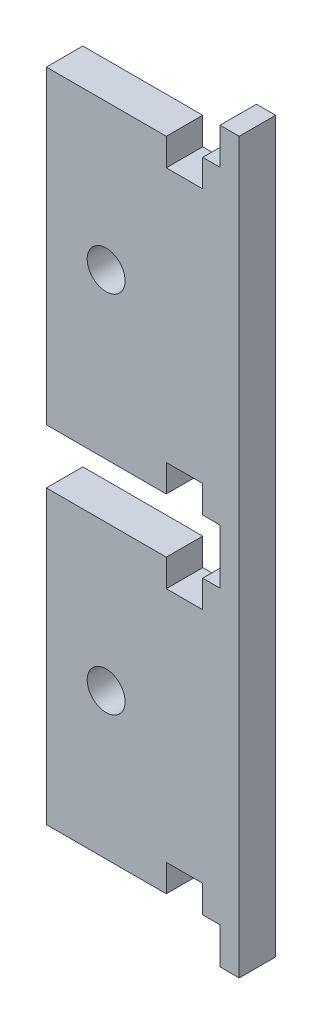
ISO-10303-21;
HEADER;
FILE_DESCRIPTION(('STEP AP214'),'2;1');
FILE_NAME('part.step','',(''),(''),'','','');
FILE_SCHEMA(('AUTOMOTIVE_DESIGN { 1 0 10303 214 1 1 1 1 }'));
ENDSEC;
DATA;
#1=APPLICATION_CONTEXT('core data for automotive mechanical design processes');
#2=APPLICATION_PROTOCOL_DEFINITION('international standard','automotive_design',2000,#1);
#3=PRODUCT_CONTEXT('',#1,'mechanical');
#4=PRODUCT('Part','Part','',(#3));
#5=PRODUCT_RELATED_PRODUCT_CATEGORY('part','',(#4));
#6=PRODUCT_DEFINITION_FORMATION('','',#4);
#7=PRODUCT_DEFINITION_CONTEXT('part definition',#1,'design');
#8=PRODUCT_DEFINITION('design','',#6,#7);
#9=PRODUCT_DEFINITION_SHAPE('','',#8);
#10=(LENGTH_UNIT() NAMED_UNIT(*) SI_UNIT(.MILLI.,.METRE.));
#11=(NAMED_UNIT(*) PLANE_ANGLE_UNIT() SI_UNIT($,.RADIAN.));
#12=(NAMED_UNIT(*) SI_UNIT($,.STERADIAN.) SOLID_ANGLE_UNIT());
#13=UNCERTAINTY_MEASURE_WITH_UNIT(LENGTH_MEASURE(1.E-05),#10,'distance_accuracy_value','');
#14=(GEOMETRIC_REPRESENTATION_CONTEXT(3) GLOBAL_UNCERTAINTY_ASSIGNED_CONTEXT((#13)) GLOBAL_UNIT_ASSIGNED_CONTEXT((#10,
#11,#12)) REPRESENTATION_CONTEXT('',''));
#15=CARTESIAN_POINT('',(0.,0.,0.));
#16=DIRECTION('',(0.,0.,1.));
#17=DIRECTION('',(1.,0.,0.));
#18=AXIS2_PLACEMENT_3D('',#15,#16,#17);
#19=CARTESIAN_POINT('',(0.,6.34999999999999,0.));
#20=DIRECTION('',(0.,1.,0.));
#21=DIRECTION('',(-1.,0.,0.));
#22=AXIS2_PLACEMENT_3D('',#19,#20,#21);
#23=PLANE('',#22);
#24=DIRECTION('',(-1.,0.,0.));
#25=VECTOR('',#24,1.);
#26=CARTESIAN_POINT('',(0.,6.34999999999999,6.35));
#27=LINE('',#26,#25);
#28=CARTESIAN_POINT('',(37.3062500000001,6.34999999999999,6.35));
#29=VERTEX_POINT('',#28);
#30=CARTESIAN_POINT('',(34.29,6.34999999999997,6.35));
#31=VERTEX_POINT('',#30);
#32=EDGE_CURVE('E304',#29,#31,#27,.T.);
#33=ORIENTED_EDGE('',*,*,#32,.T.);
#34=DIRECTION('',(0.,0.,1.));
#35=VECTOR('',#34,1.);
#36=CARTESIAN_POINT('',(34.29,6.34999999999997,0.));
#37=LINE('',#36,#35);
#38=CARTESIAN_POINT('',(34.29,6.34999999999997,0.));
#39=VERTEX_POINT('',#38);
#40=EDGE_CURVE('E382',#39,#31,#37,.T.);
#41=ORIENTED_EDGE('',*,*,#40,.F.);
#42=DIRECTION('',(-1.,0.,0.));
#43=VECTOR('',#42,1.);
#44=CARTESIAN_POINT('',(0.,6.34999999999999,0.));
#45=LINE('',#44,#43);
#46=CARTESIAN_POINT('',(37.3062500000001,6.34999999999999,0.));
#47=VERTEX_POINT('',#46);
#48=EDGE_CURVE('E305',#47,#39,#45,.T.);
#49=ORIENTED_EDGE('',*,*,#48,.F.);
#50=DIRECTION('',(0.,0.,1.));
#51=VECTOR('',#50,1.);
#52=CARTESIAN_POINT('',(37.3062500000001,6.34999999999999,0.));
#53=LINE('',#52,#51);
#54=EDGE_CURVE('E319',#47,#29,#53,.T.);
#55=ORIENTED_EDGE('',*,*,#54,.T.);
#56=EDGE_LOOP('',(#33,#41,#49,#55));
#57=FACE_BOUND('',#56,.T.);
#58=ADVANCED_FACE('F33',(#57),#23,.F.);
#59=CARTESIAN_POINT('',(0.,66.6750000000059,0.));
#60=DIRECTION('',(0.,1.,0.));
#61=DIRECTION('',(-1.,0.,0.));
#62=AXIS2_PLACEMENT_3D('',#59,#60,#61);
#63=PLANE('',#62);
#64=DIRECTION('',(-1.,0.,0.));
#65=VECTOR('',#64,1.);
#66=CARTESIAN_POINT('',(0.,66.6750000000059,6.35));
#67=LINE('',#66,#65);
#68=CARTESIAN_POINT('',(37.3062500000001,66.6750000000059,6.35));
#69=VERTEX_POINT('',#68);
#70=CARTESIAN_POINT('',(34.2899999999998,66.6750000000033,6.35));
#71=VERTEX_POINT('',#70);
#72=EDGE_CURVE('E289',#69,#71,#67,.T.);
#73=ORIENTED_EDGE('',*,*,#72,.T.);
#74=DIRECTION('',(0.,0.,1.));
#75=VECTOR('',#74,1.);
#76=CARTESIAN_POINT('',(34.2899999999998,66.6750000000033,0.));
#77=LINE('',#76,#75);
#78=CARTESIAN_POINT('',(34.2899999999998,66.6750000000033,0.));
#79=VERTEX_POINT('',#78);
#80=EDGE_CURVE('E444',#79,#71,#77,.T.);
#81=ORIENTED_EDGE('',*,*,#80,.F.);
#82=DIRECTION('',(-1.,0.,0.));
#83=VECTOR('',#82,1.);
#84=CARTESIAN_POINT('',(0.,66.6750000000059,0.));
#85=LINE('',#84,#83);
#86=CARTESIAN_POINT('',(37.3062500000001,66.6750000000059,0.));
#87=VERTEX_POINT('',#86);
#88=EDGE_CURVE('E277',#87,#79,#85,.T.);
#89=ORIENTED_EDGE('',*,*,#88,.F.);
#90=DIRECTION('',(0.,0.,1.));
#91=VECTOR('',#90,1.);
#92=CARTESIAN_POINT('',(37.3062500000001,66.6750000000059,0.));
#93=LINE('',#92,#91);
#94=EDGE_CURVE('E295',#87,#69,#93,.T.);
#95=ORIENTED_EDGE('',*,*,#94,.T.);
#96=EDGE_LOOP('',(#73,#81,#89,#95));
#97=FACE_BOUND('',#96,.T.);
#98=ADVANCED_FACE('F502',(#97),#63,.F.);
#99=CARTESIAN_POINT('',(0.,57.1500000000057,0.));
#100=DIRECTION('',(0.,-1.,0.));
#101=DIRECTION('',(0.,0.,-1.));
#102=AXIS2_PLACEMENT_3D('',#99,#100,#101);
#103=PLANE('',#102);
#104=DIRECTION('',(1.,0.,0.));
#105=VECTOR('',#104,1.);
#106=CARTESIAN_POINT('',(0.,57.1500000000057,0.));
#107=LINE('',#106,#105);
#108=CARTESIAN_POINT('',(34.2899999999997,57.1500000000031,0.));
#109=VERTEX_POINT('',#108);
#110=CARTESIAN_POINT('',(37.3062500000001,57.1500000000057,0.));
#111=VERTEX_POINT('',#110);
#112=EDGE_CURVE('E273',#109,#111,#107,.T.);
#113=ORIENTED_EDGE('',*,*,#112,.F.);
#114=DIRECTION('',(0.,0.,1.));
#115=VECTOR('',#114,1.);
#116=CARTESIAN_POINT('',(34.2899999999997,57.1500000000031,0.));
#117=LINE('',#116,#115);
#118=CARTESIAN_POINT('',(34.2899999999997,57.1500000000031,6.35));
#119=VERTEX_POINT('',#118);
#120=EDGE_CURVE('E413',#109,#119,#117,.T.);
#121=ORIENTED_EDGE('',*,*,#120,.T.);
#122=DIRECTION('',(1.,0.,0.));
#123=VECTOR('',#122,1.);
#124=CARTESIAN_POINT('',(0.,57.1500000000057,6.35));
#125=LINE('',#124,#123);
#126=CARTESIAN_POINT('',(37.3062500000001,57.1500000000057,6.35));
#127=VERTEX_POINT('',#126);
#128=EDGE_CURVE('E285',#119,#127,#125,.T.);
#129=ORIENTED_EDGE('',*,*,#128,.T.);
#130=DIRECTION('',(0.,0.,1.));
#131=VECTOR('',#130,1.);
#132=CARTESIAN_POINT('',(37.3062500000001,57.1500000000057,0.));
#133=LINE('',#132,#131);
#134=EDGE_CURVE('E297',#111,#127,#133,.T.);
#135=ORIENTED_EDGE('',*,*,#134,.F.);
#136=EDGE_LOOP('',(#113,#121,#129,#135));
#137=FACE_BOUND('',#136,.T.);
#138=ADVANCED_FACE('F510',(#137),#103,.F.);
#139=CARTESIAN_POINT('',(0.,120.650000000002,0.));
#140=DIRECTION('',(0.,-1.,0.));
#141=DIRECTION('',(0.,0.,-1.));
#142=AXIS2_PLACEMENT_3D('',#139,#140,#141);
#143=PLANE('',#142);
#144=DIRECTION('',(1.,0.,0.));
#145=VECTOR('',#144,1.);
#146=CARTESIAN_POINT('',(0.,120.650000000002,0.));
#147=LINE('',#146,#145);
#148=CARTESIAN_POINT('',(34.2899999999998,120.65,0.));
#149=VERTEX_POINT('',#148);
#150=CARTESIAN_POINT('',(37.3062500000001,120.650000000002,0.));
#151=VERTEX_POINT('',#150);
#152=EDGE_CURVE('E235',#149,#151,#147,.T.);
#153=ORIENTED_EDGE('',*,*,#152,.F.);
#154=DIRECTION('',(0.,0.,1.));
#155=VECTOR('',#154,1.);
#156=CARTESIAN_POINT('',(34.2899999999998,120.65,0.));
#157=LINE('',#156,#155);
#158=CARTESIAN_POINT('',(34.2899999999998,120.65,6.35));
#159=VERTEX_POINT('',#158);
#160=EDGE_CURVE('E218',#149,#159,#157,.T.);
#161=ORIENTED_EDGE('',*,*,#160,.T.);
#162=DIRECTION('',(1.,0.,0.));
#163=VECTOR('',#162,1.);
#164=CARTESIAN_POINT('',(0.,120.650000000002,6.35));
#165=LINE('',#164,#163);
#166=CARTESIAN_POINT('',(37.3062500000001,120.650000000002,6.35));
#167=VERTEX_POINT('',#166);
#168=EDGE_CURVE('E261',#159,#167,#165,.T.);
#169=ORIENTED_EDGE('',*,*,#168,.T.);
#170=DIRECTION('',(0.,0.,1.));
#171=VECTOR('',#170,1.);
#172=CARTESIAN_POINT('',(37.3062500000001,120.650000000002,0.));
#173=LINE('',#172,#171);
#174=EDGE_CURVE('E245',#151,#167,#173,.T.);
#175=ORIENTED_EDGE('',*,*,#174,.F.);
#176=EDGE_LOOP('',(#153,#161,#169,#175));
#177=FACE_BOUND('',#176,.T.);
#178=ADVANCED_FACE('F243',(#177),#143,.F.);
#179=CARTESIAN_POINT('',(0.,0.,0.));
#180=DIRECTION('',(0.,0.,-1.));
#181=DIRECTION('',(-1.,0.,0.));
#182=AXIS2_PLACEMENT_3D('',#179,#180,#181);
#183=PLANE('',#182);
#184=DIRECTION('',(0.,1.,0.));
#185=VECTOR('',#184,1.);
#186=CARTESIAN_POINT('',(34.2899999999998,120.65,0.));
#187=LINE('',#186,#185);
#188=CARTESIAN_POINT('',(34.2899999999998,115.8875,0.));
#189=VERTEX_POINT('',#188);
#190=EDGE_CURVE('E221',#189,#149,#187,.T.);
#191=ORIENTED_EDGE('',*,*,#190,.T.);
#192=ORIENTED_EDGE('',*,*,#152,.T.);
#193=DIRECTION('',(0.,-1.,0.));
#194=VECTOR('',#193,1.);
#195=CARTESIAN_POINT('',(37.3062500000001,0.,0.));
#196=LINE('',#195,#194);
#197=CARTESIAN_POINT('',(37.30625,127.,0.));
#198=VERTEX_POINT('',#197);
#199=EDGE_CURVE('E250',#198,#151,#196,.T.);
#200=ORIENTED_EDGE('',*,*,#199,.F.);
#201=DIRECTION('',(-1.,0.,0.));
#202=VECTOR('',#201,1.);
#203=CARTESIAN_POINT('',(0.,127.,0.));
#204=LINE('',#203,#202);
#205=CARTESIAN_POINT('',(40.64,127.,0.));
#206=VERTEX_POINT('',#205);
#207=EDGE_CURVE('E345',#206,#198,#204,.T.);
#208=ORIENTED_EDGE('',*,*,#207,.F.);
#209=DIRECTION('',(0.,1.,0.));
#210=VECTOR('',#209,1.);
#211=CARTESIAN_POINT('',(40.64,0.,0.));
#212=LINE('',#211,#210);
#213=CARTESIAN_POINT('',(40.64,0.,0.));
#214=VERTEX_POINT('',#213);
#215=EDGE_CURVE('E351',#214,#206,#212,.T.);
#216=ORIENTED_EDGE('',*,*,#215,.F.);
#217=DIRECTION('',(1.,0.,0.));
#218=VECTOR('',#217,1.);
#219=CARTESIAN_POINT('',(0.,0.,0.));
#220=LINE('',#219,#218);
#221=CARTESIAN_POINT('',(37.3062500000001,0.,0.));
#222=VERTEX_POINT('',#221);
#223=EDGE_CURVE('E341',#222,#214,#220,.T.);
#224=ORIENTED_EDGE('',*,*,#223,.F.);
#225=DIRECTION('',(0.,-1.,0.));
#226=VECTOR('',#225,1.);
#227=CARTESIAN_POINT('',(37.3062500000001,0.,0.));
#228=LINE('',#227,#226);
#229=EDGE_CURVE('E301',#47,#222,#228,.T.);
#230=ORIENTED_EDGE('',*,*,#229,.F.);
#231=ORIENTED_EDGE('',*,*,#48,.T.);
#232=DIRECTION('',(0.,1.,0.));
#233=VECTOR('',#232,1.);
#234=CARTESIAN_POINT('',(34.29,11.1125,0.));
#235=LINE('',#234,#233);
#236=CARTESIAN_POINT('',(34.29,11.1125,0.));
#237=VERTEX_POINT('',#236);
#238=EDGE_CURVE('E405',#39,#237,#235,.T.);
#239=ORIENTED_EDGE('',*,*,#238,.T.);
#240=DIRECTION('',(-1.,0.,0.));
#241=VECTOR('',#240,1.);
#242=CARTESIAN_POINT('',(34.29,11.1125,0.));
#243=LINE('',#242,#241);
#244=CARTESIAN_POINT('',(27.94,11.1125,0.));
#245=VERTEX_POINT('',#244);
#246=EDGE_CURVE('E401',#237,#245,#243,.T.);
#247=ORIENTED_EDGE('',*,*,#246,.T.);
#248=DIRECTION('',(0.,-1.,0.));
#249=VECTOR('',#248,1.);
#250=CARTESIAN_POINT('',(27.94,11.1125,0.));
#251=LINE('',#250,#249);
#252=CARTESIAN_POINT('',(27.94,6.34999999999997,0.));
#253=VERTEX_POINT('',#252);
#254=EDGE_CURVE('E397',#245,#253,#251,.T.);
#255=ORIENTED_EDGE('',*,*,#254,.T.);
#256=CARTESIAN_POINT('',(7.05049999999835,6.34999999999999,0.));
#257=VERTEX_POINT('',#256);
#258=EDGE_CURVE('E303',#253,#257,#45,.T.);
#259=ORIENTED_EDGE('',*,*,#258,.T.);
#260=DIRECTION('',(0.,-1.,0.));
#261=VECTOR('',#260,1.);
#262=CARTESIAN_POINT('',(7.05049999999835,0.,0.));
#263=LINE('',#262,#261);
#264=CARTESIAN_POINT('',(7.05049999999834,57.1500000000057,0.));
#265=VERTEX_POINT('',#264);
#266=EDGE_CURVE('E266',#265,#257,#263,.T.);
#267=ORIENTED_EDGE('',*,*,#266,.F.);
#268=CARTESIAN_POINT('',(27.9399999999997,57.1500000000057,0.));
#269=VERTEX_POINT('',#268);
#270=EDGE_CURVE('E269',#265,#269,#107,.T.);
#271=ORIENTED_EDGE('',*,*,#270,.T.);
#272=DIRECTION('',(0.,-1.,0.));
#273=VECTOR('',#272,1.);
#274=CARTESIAN_POINT('',(27.9399999999997,57.1500000000031,0.));
#275=LINE('',#274,#273);
#276=CARTESIAN_POINT('',(27.9399999999997,52.3875000000031,0.));
#277=VERTEX_POINT('',#276);
#278=EDGE_CURVE('E432',#269,#277,#275,.T.);
#279=ORIENTED_EDGE('',*,*,#278,.T.);
#280=DIRECTION('',(1.,0.,0.));
#281=VECTOR('',#280,1.);
#282=CARTESIAN_POINT('',(34.2899999999997,52.3875000000031,0.));
#283=LINE('',#282,#281);
#284=CARTESIAN_POINT('',(34.2899999999997,52.3875000000031,0.));
#285=VERTEX_POINT('',#284);
#286=EDGE_CURVE('E417',#277,#285,#283,.T.);
#287=ORIENTED_EDGE('',*,*,#286,.T.);
#288=DIRECTION('',(0.,1.,0.));
#289=VECTOR('',#288,1.);
#290=CARTESIAN_POINT('',(34.2899999999997,57.1500000000031,0.));
#291=LINE('',#290,#289);
#292=EDGE_CURVE('E427',#285,#109,#291,.T.);
#293=ORIENTED_EDGE('',*,*,#292,.T.);
#294=ORIENTED_EDGE('',*,*,#112,.T.);
#295=DIRECTION('',(0.,-1.,0.));
#296=VECTOR('',#295,1.);
#297=CARTESIAN_POINT('',(37.3062500000001,0.,0.));
#298=LINE('',#297,#296);
#299=EDGE_CURVE('E272',#87,#111,#298,.T.);
#300=ORIENTED_EDGE('',*,*,#299,.F.);
#301=ORIENTED_EDGE('',*,*,#88,.T.);
#302=DIRECTION('',(0.,1.,0.));
#303=VECTOR('',#302,1.);
#304=CARTESIAN_POINT('',(34.2899999999998,71.4375000000033,0.));
#305=LINE('',#304,#303);
#306=CARTESIAN_POINT('',(34.2899999999998,71.4375000000033,0.));
#307=VERTEX_POINT('',#306);
#308=EDGE_CURVE('E447',#79,#307,#305,.T.);
#309=ORIENTED_EDGE('',*,*,#308,.T.);
#310=DIRECTION('',(-1.,0.,0.));
#311=VECTOR('',#310,1.);
#312=CARTESIAN_POINT('',(34.2899999999998,71.4375000000033,0.));
#313=LINE('',#312,#311);
#314=CARTESIAN_POINT('',(27.9399999999998,71.4375000000033,0.));
#315=VERTEX_POINT('',#314);
#316=EDGE_CURVE('E455',#307,#315,#313,.T.);
#317=ORIENTED_EDGE('',*,*,#316,.T.);
#318=DIRECTION('',(0.,-1.,0.));
#319=VECTOR('',#318,1.);
#320=CARTESIAN_POINT('',(27.9399999999998,71.4375000000033,0.));
#321=LINE('',#320,#319);
#322=CARTESIAN_POINT('',(27.9399999999998,66.6750000000033,0.));
#323=VERTEX_POINT('',#322);
#324=EDGE_CURVE('E440',#315,#323,#321,.T.);
#325=ORIENTED_EDGE('',*,*,#324,.T.);
#326=CARTESIAN_POINT('',(7.05049999999834,66.6750000000059,0.));
#327=VERTEX_POINT('',#326);
#328=EDGE_CURVE('E276',#323,#327,#85,.T.);
#329=ORIENTED_EDGE('',*,*,#328,.T.);
#330=CARTESIAN_POINT('',(7.05049999999834,120.650000000002,0.));
#331=VERTEX_POINT('',#330);
#332=EDGE_CURVE('E324',#331,#327,#263,.T.);
#333=ORIENTED_EDGE('',*,*,#332,.F.);
#334=CARTESIAN_POINT('',(27.9399999999998,120.650000000002,0.));
#335=VERTEX_POINT('',#334);
#336=EDGE_CURVE('E246',#331,#335,#147,.T.);
#337=ORIENTED_EDGE('',*,*,#336,.T.);
#338=DIRECTION('',(0.,-1.,0.));
#339=VECTOR('',#338,1.);
#340=CARTESIAN_POINT('',(27.9399999999998,120.65,0.));
#341=LINE('',#340,#339);
#342=CARTESIAN_POINT('',(27.9399999999998,115.8875,0.));
#343=VERTEX_POINT('',#342);
#344=EDGE_CURVE('E239',#335,#343,#341,.T.);
#345=ORIENTED_EDGE('',*,*,#344,.T.);
#346=DIRECTION('',(1.,0.,0.));
#347=VECTOR('',#346,1.);
#348=CARTESIAN_POINT('',(34.2899999999998,115.8875,0.));
#349=LINE('',#348,#347);
#350=EDGE_CURVE('E229',#343,#189,#349,.T.);
#351=ORIENTED_EDGE('',*,*,#350,.T.);
#352=EDGE_LOOP('',(#191,#192,#200,#208,#216,#224,#230,#231,#239,#247,#255,#259,#267,#271,#279,
#287,#293,#294,#300,#301,#309,#317,#325,#329,#333,#337,#345,#351));
#353=FACE_BOUND('',#352,.T.);
#354=CARTESIAN_POINT('',(17.4625000000007,31.7500000000036,0.));
#355=DIRECTION('',(0.,0.,1.));
#356=DIRECTION('',(1.,0.,0.));
#357=AXIS2_PLACEMENT_3D('',#354,#355,#356);
#358=CIRCLE('',#357,3.3);
#359=CARTESIAN_POINT('',(20.7625000000007,31.7500000000036,0.));
#360=VERTEX_POINT('',#359);
#361=EDGE_CURVE('E332',#360,#360,#358,.T.);
#362=ORIENTED_EDGE('',*,*,#361,.T.);
#363=EDGE_LOOP('',(#362));
#364=FACE_BOUND('',#363,.T.);
#365=CARTESIAN_POINT('',(17.4624999999983,95.25,0.));
#366=DIRECTION('',(0.,0.,1.));
#367=DIRECTION('',(1.,0.,0.));
#368=AXIS2_PLACEMENT_3D('',#365,#366,#367);
#369=CIRCLE('',#368,3.3);
#370=CARTESIAN_POINT('',(20.7624999999983,95.25,0.));
#371=VERTEX_POINT('',#370);
#372=EDGE_CURVE('E338',#371,#371,#369,.T.);
#373=ORIENTED_EDGE('',*,*,#372,.T.);
#374=EDGE_LOOP('',(#373));
#375=FACE_BOUND('',#374,.T.);
#376=ADVANCED_FACE('F232',(#353,#364,#375),#183,.T.);
#377=CARTESIAN_POINT('',(0.,0.,6.35));
#378=DIRECTION('',(0.,0.,-1.));
#379=DIRECTION('',(-1.,0.,0.));
#380=AXIS2_PLACEMENT_3D('',#377,#378,#379);
#381=PLANE('',#380);
#382=CARTESIAN_POINT('',(17.4625000000007,31.7500000000036,6.35));
#383=DIRECTION('',(0.,0.,1.));
#384=DIRECTION('',(1.,0.,0.));
#385=AXIS2_PLACEMENT_3D('',#382,#383,#384);
#386=CIRCLE('',#385,3.29999999999999);
#387=CARTESIAN_POINT('',(20.7625000000006,31.7500000000036,6.35));
#388=VERTEX_POINT('',#387);
#389=EDGE_CURVE('E329',#388,#388,#386,.T.);
#390=ORIENTED_EDGE('',*,*,#389,.F.);
#391=EDGE_LOOP('',(#390));
#392=FACE_BOUND('',#391,.T.);
#393=CARTESIAN_POINT('',(17.4624999999983,95.25,6.35));
#394=DIRECTION('',(0.,0.,1.));
#395=DIRECTION('',(1.,0.,0.));
#396=AXIS2_PLACEMENT_3D('',#393,#394,#395);
#397=CIRCLE('',#396,3.29999999999999);
#398=CARTESIAN_POINT('',(20.7624999999983,95.25,6.35));
#399=VERTEX_POINT('',#398);
#400=EDGE_CURVE('E335',#399,#399,#397,.T.);
#401=ORIENTED_EDGE('',*,*,#400,.F.);
#402=EDGE_LOOP('',(#401));
#403=FACE_BOUND('',#402,.T.);
#404=ORIENTED_EDGE('',*,*,#168,.F.);
#405=DIRECTION('',(0.,1.,0.));
#406=VECTOR('',#405,1.);
#407=CARTESIAN_POINT('',(34.2899999999998,120.65,6.35));
#408=LINE('',#407,#406);
#409=CARTESIAN_POINT('',(34.2899999999998,115.8875,6.35));
#410=VERTEX_POINT('',#409);
#411=EDGE_CURVE('E224',#410,#159,#408,.T.);
#412=ORIENTED_EDGE('',*,*,#411,.F.);
#413=DIRECTION('',(1.,0.,0.));
#414=VECTOR('',#413,1.);
#415=CARTESIAN_POINT('',(34.2899999999998,115.8875,6.35));
#416=LINE('',#415,#414);
#417=CARTESIAN_POINT('',(27.9399999999998,115.8875,6.35));
#418=VERTEX_POINT('',#417);
#419=EDGE_CURVE('E240',#418,#410,#416,.T.);
#420=ORIENTED_EDGE('',*,*,#419,.F.);
#421=DIRECTION('',(0.,-1.,0.));
#422=VECTOR('',#421,1.);
#423=CARTESIAN_POINT('',(27.9399999999998,120.65,6.35));
#424=LINE('',#423,#422);
#425=CARTESIAN_POINT('',(27.9399999999998,120.65,6.35));
#426=VERTEX_POINT('',#425);
#427=EDGE_CURVE('E466',#426,#418,#424,.T.);
#428=ORIENTED_EDGE('',*,*,#427,.F.);
#429=CARTESIAN_POINT('',(7.05049999999834,120.650000000002,6.35));
#430=VERTEX_POINT('',#429);
#431=EDGE_CURVE('E252',#430,#426,#165,.T.);
#432=ORIENTED_EDGE('',*,*,#431,.F.);
#433=DIRECTION('',(0.,1.,0.));
#434=VECTOR('',#433,1.);
#435=CARTESIAN_POINT('',(7.05049999999835,0.,6.35));
#436=LINE('',#435,#434);
#437=CARTESIAN_POINT('',(7.05049999999834,66.6750000000059,6.35));
#438=VERTEX_POINT('',#437);
#439=EDGE_CURVE('E325',#438,#430,#436,.T.);
#440=ORIENTED_EDGE('',*,*,#439,.F.);
#441=CARTESIAN_POINT('',(27.9399999999998,66.6750000000059,6.35));
#442=VERTEX_POINT('',#441);
#443=EDGE_CURVE('E288',#442,#438,#67,.T.);
#444=ORIENTED_EDGE('',*,*,#443,.F.);
#445=DIRECTION('',(0.,-1.,0.));
#446=VECTOR('',#445,1.);
#447=CARTESIAN_POINT('',(27.9399999999998,71.4375000000033,6.35));
#448=LINE('',#447,#446);
#449=CARTESIAN_POINT('',(27.9399999999998,71.4375000000033,6.35));
#450=VERTEX_POINT('',#449);
#451=EDGE_CURVE('E56',#450,#442,#448,.T.);
#452=ORIENTED_EDGE('',*,*,#451,.F.);
#453=DIRECTION('',(-1.,0.,0.));
#454=VECTOR('',#453,1.);
#455=CARTESIAN_POINT('',(34.2899999999998,71.4375000000033,6.35));
#456=LINE('',#455,#454);
#457=CARTESIAN_POINT('',(34.2899999999998,71.4375000000033,6.35));
#458=VERTEX_POINT('',#457);
#459=EDGE_CURVE('E448',#458,#450,#456,.T.);
#460=ORIENTED_EDGE('',*,*,#459,.F.);
#461=DIRECTION('',(0.,1.,0.));
#462=VECTOR('',#461,1.);
#463=CARTESIAN_POINT('',(34.2899999999998,71.4375000000033,6.35));
#464=LINE('',#463,#462);
#465=EDGE_CURVE('E423',#71,#458,#464,.T.);
#466=ORIENTED_EDGE('',*,*,#465,.F.);
#467=ORIENTED_EDGE('',*,*,#72,.F.);
#468=DIRECTION('',(0.,-1.,0.));
#469=VECTOR('',#468,1.);
#470=CARTESIAN_POINT('',(37.3062500000001,0.,6.35));
#471=LINE('',#470,#469);
#472=EDGE_CURVE('E284',#69,#127,#471,.T.);
#473=ORIENTED_EDGE('',*,*,#472,.T.);
#474=ORIENTED_EDGE('',*,*,#128,.F.);
#475=DIRECTION('',(0.,1.,0.));
#476=VECTOR('',#475,1.);
#477=CARTESIAN_POINT('',(34.2899999999997,57.1500000000031,6.35));
#478=LINE('',#477,#476);
#479=CARTESIAN_POINT('',(34.2899999999997,52.3875000000031,6.35));
#480=VERTEX_POINT('',#479);
#481=EDGE_CURVE('E386',#480,#119,#478,.T.);
#482=ORIENTED_EDGE('',*,*,#481,.F.);
#483=DIRECTION('',(1.,0.,0.));
#484=VECTOR('',#483,1.);
#485=CARTESIAN_POINT('',(34.2899999999997,52.3875000000031,6.35));
#486=LINE('',#485,#484);
#487=CARTESIAN_POINT('',(27.9399999999997,52.3875000000031,6.35));
#488=VERTEX_POINT('',#487);
#489=EDGE_CURVE('E424',#488,#480,#486,.T.);
#490=ORIENTED_EDGE('',*,*,#489,.F.);
#491=DIRECTION('',(0.,-1.,0.));
#492=VECTOR('',#491,1.);
#493=CARTESIAN_POINT('',(27.9399999999997,57.1500000000031,6.35));
#494=LINE('',#493,#492);
#495=CARTESIAN_POINT('',(27.9399999999997,57.1500000000031,6.35));
#496=VERTEX_POINT('',#495);
#497=EDGE_CURVE('E389',#496,#488,#494,.T.);
#498=ORIENTED_EDGE('',*,*,#497,.F.);
#499=CARTESIAN_POINT('',(7.05049999999834,57.1500000000057,6.35));
#500=VERTEX_POINT('',#499);
#501=EDGE_CURVE('E281',#500,#496,#125,.T.);
#502=ORIENTED_EDGE('',*,*,#501,.F.);
#503=CARTESIAN_POINT('',(7.05049999999835,6.34999999999999,6.35));
#504=VERTEX_POINT('',#503);
#505=EDGE_CURVE('E328',#504,#500,#436,.T.);
#506=ORIENTED_EDGE('',*,*,#505,.F.);
#507=CARTESIAN_POINT('',(27.94,6.34999999999999,6.35));
#508=VERTEX_POINT('',#507);
#509=EDGE_CURVE('E312',#508,#504,#27,.T.);
#510=ORIENTED_EDGE('',*,*,#509,.F.);
#511=DIRECTION('',(0.,-1.,0.));
#512=VECTOR('',#511,1.);
#513=CARTESIAN_POINT('',(27.94,11.1125,6.35));
#514=LINE('',#513,#512);
#515=CARTESIAN_POINT('',(27.94,11.1125,6.35));
#516=VERTEX_POINT('',#515);
#517=EDGE_CURVE('E48',#516,#508,#514,.T.);
#518=ORIENTED_EDGE('',*,*,#517,.F.);
#519=DIRECTION('',(-1.,0.,0.));
#520=VECTOR('',#519,1.);
#521=CARTESIAN_POINT('',(34.29,11.1125,6.35));
#522=LINE('',#521,#520);
#523=CARTESIAN_POINT('',(34.29,11.1125,6.35));
#524=VERTEX_POINT('',#523);
#525=EDGE_CURVE('E410',#524,#516,#522,.T.);
#526=ORIENTED_EDGE('',*,*,#525,.F.);
#527=DIRECTION('',(0.,1.,0.));
#528=VECTOR('',#527,1.);
#529=CARTESIAN_POINT('',(34.29,11.1125,6.35));
#530=LINE('',#529,#528);
#531=EDGE_CURVE('E409',#31,#524,#530,.T.);
#532=ORIENTED_EDGE('',*,*,#531,.F.);
#533=ORIENTED_EDGE('',*,*,#32,.F.);
#534=DIRECTION('',(0.,-1.,0.));
#535=VECTOR('',#534,1.);
#536=CARTESIAN_POINT('',(37.3062500000001,0.,6.35));
#537=LINE('',#536,#535);
#538=CARTESIAN_POINT('',(37.3062500000001,0.,6.35));
#539=VERTEX_POINT('',#538);
#540=EDGE_CURVE('E309',#29,#539,#537,.T.);
#541=ORIENTED_EDGE('',*,*,#540,.T.);
#542=DIRECTION('',(1.,0.,0.));
#543=VECTOR('',#542,1.);
#544=CARTESIAN_POINT('',(0.,0.,6.35));
#545=LINE('',#544,#543);
#546=CARTESIAN_POINT('',(40.64,0.,6.35));
#547=VERTEX_POINT('',#546);
#548=EDGE_CURVE('E342',#539,#547,#545,.T.);
#549=ORIENTED_EDGE('',*,*,#548,.T.);
#550=DIRECTION('',(0.,1.,0.));
#551=VECTOR('',#550,1.);
#552=CARTESIAN_POINT('',(40.64,0.,6.35));
#553=LINE('',#552,#551);
#554=CARTESIAN_POINT('',(40.64,127.,6.35));
#555=VERTEX_POINT('',#554);
#556=EDGE_CURVE('E344',#547,#555,#553,.T.);
#557=ORIENTED_EDGE('',*,*,#556,.T.);
#558=DIRECTION('',(-1.,0.,0.));
#559=VECTOR('',#558,1.);
#560=CARTESIAN_POINT('',(0.,127.,6.35));
#561=LINE('',#560,#559);
#562=CARTESIAN_POINT('',(37.30625,127.,6.35));
#563=VERTEX_POINT('',#562);
#564=EDGE_CURVE('E347',#555,#563,#561,.T.);
#565=ORIENTED_EDGE('',*,*,#564,.T.);
#566=DIRECTION('',(0.,-1.,0.));
#567=VECTOR('',#566,1.);
#568=CARTESIAN_POINT('',(37.3062500000001,0.,6.35));
#569=LINE('',#568,#567);
#570=EDGE_CURVE('E247',#563,#167,#569,.T.);
#571=ORIENTED_EDGE('',*,*,#570,.T.);
#572=EDGE_LOOP('',(#404,#412,#420,#428,#432,#440,#444,#452,#460,#466,#467,#473,#474,#482,#490,
#498,#502,#506,#510,#518,#526,#532,#533,#541,#549,#557,#565,#571));
#573=FACE_BOUND('',#572,.T.);
#574=ADVANCED_FACE('F367',(#392,#403,#573),#381,.F.);
#575=CARTESIAN_POINT('',(0.,0.,6.35));
#576=DIRECTION('',(0.,1.,0.));
#577=DIRECTION('',(0.,0.,1.));
#578=AXIS2_PLACEMENT_3D('',#575,#576,#577);
#579=PLANE('',#578);
#580=DIRECTION('',(0.,0.,1.));
#581=VECTOR('',#580,1.);
#582=CARTESIAN_POINT('',(37.3062500000001,0.,0.));
#583=LINE('',#582,#581);
#584=EDGE_CURVE('E308',#222,#539,#583,.T.);
#585=ORIENTED_EDGE('',*,*,#584,.F.);
#586=ORIENTED_EDGE('',*,*,#223,.T.);
#587=DIRECTION('',(0.,0.,-1.));
#588=VECTOR('',#587,1.);
#589=CARTESIAN_POINT('',(40.64,0.,6.35));
#590=LINE('',#589,#588);
#591=EDGE_CURVE('E11',#547,#214,#590,.T.);
#592=ORIENTED_EDGE('',*,*,#591,.F.);
#593=ORIENTED_EDGE('',*,*,#548,.F.);
#594=EDGE_LOOP('',(#585,#586,#592,#593));
#595=FACE_BOUND('',#594,.T.);
#596=ADVANCED_FACE('F35',(#595),#579,.F.);
#597=CARTESIAN_POINT('',(0.,127.,6.35));
#598=DIRECTION('',(0.,-1.,0.));
#599=DIRECTION('',(1.,0.,0.));
#600=AXIS2_PLACEMENT_3D('',#597,#598,#599);
#601=PLANE('',#600);
#602=DIRECTION('',(0.,0.,1.));
#603=VECTOR('',#602,1.);
#604=CARTESIAN_POINT('',(37.30625,127.,0.));
#605=LINE('',#604,#603);
#606=EDGE_CURVE('E263',#198,#563,#605,.T.);
#607=ORIENTED_EDGE('',*,*,#606,.T.);
#608=ORIENTED_EDGE('',*,*,#564,.F.);
#609=DIRECTION('',(0.,0.,-1.));
#610=VECTOR('',#609,1.);
#611=CARTESIAN_POINT('',(40.64,127.,6.35));
#612=LINE('',#611,#610);
#613=EDGE_CURVE('E41',#555,#206,#612,.T.);
#614=ORIENTED_EDGE('',*,*,#613,.T.);
#615=ORIENTED_EDGE('',*,*,#207,.T.);
#616=EDGE_LOOP('',(#607,#608,#614,#615));
#617=FACE_BOUND('',#616,.T.);
#618=ADVANCED_FACE('F359',(#617),#601,.F.);
#619=CARTESIAN_POINT('',(7.05049999999835,0.,0.));
#620=DIRECTION('',(-1.,0.,0.));
#621=DIRECTION('',(0.,-1.,0.));
#622=AXIS2_PLACEMENT_3D('',#619,#620,#621);
#623=PLANE('',#622);
#624=DIRECTION('',(0.,0.,1.));
#625=VECTOR('',#624,1.);
#626=CARTESIAN_POINT('',(7.05049999999834,120.650000000002,0.));
#627=LINE('',#626,#625);
#628=EDGE_CURVE('E259',#331,#430,#627,.T.);
#629=ORIENTED_EDGE('',*,*,#628,.F.);
#630=ORIENTED_EDGE('',*,*,#332,.T.);
#631=DIRECTION('',(0.,0.,1.));
#632=VECTOR('',#631,1.);
#633=CARTESIAN_POINT('',(7.05049999999834,66.6750000000059,0.));
#634=LINE('',#633,#632);
#635=EDGE_CURVE('E292',#327,#438,#634,.T.);
#636=ORIENTED_EDGE('',*,*,#635,.T.);
#637=ORIENTED_EDGE('',*,*,#439,.T.);
#638=EDGE_LOOP('',(#629,#630,#636,#637));
#639=FACE_BOUND('',#638,.T.);
#640=ADVANCED_FACE('F484',(#639),#623,.T.);
#641=CARTESIAN_POINT('',(40.64,0.,6.35));
#642=DIRECTION('',(-1.,0.,0.));
#643=DIRECTION('',(0.,0.,1.));
#644=AXIS2_PLACEMENT_3D('',#641,#642,#643);
#645=PLANE('',#644);
#646=ORIENTED_EDGE('',*,*,#215,.T.);
#647=ORIENTED_EDGE('',*,*,#613,.F.);
#648=ORIENTED_EDGE('',*,*,#556,.F.);
#649=ORIENTED_EDGE('',*,*,#591,.T.);
#650=EDGE_LOOP('',(#646,#647,#648,#649));
#651=FACE_BOUND('',#650,.T.);
#652=ADVANCED_FACE('F370',(#651),#645,.F.);
#653=CARTESIAN_POINT('',(17.4624999999983,95.25,6.35));
#654=DIRECTION('',(0.,0.,1.));
#655=DIRECTION('',(1.,0.,0.));
#656=AXIS2_PLACEMENT_3D('',#653,#654,#655);
#657=CYLINDRICAL_SURFACE('',#656,3.29999999999999);
#658=ORIENTED_EDGE('',*,*,#372,.F.);
#659=EDGE_LOOP('',(#658));
#660=FACE_BOUND('',#659,.T.);
#661=ORIENTED_EDGE('',*,*,#400,.T.);
#662=EDGE_LOOP('',(#661));
#663=FACE_BOUND('',#662,.T.);
#664=ADVANCED_FACE('F567',(#660,#663),#657,.F.);
#665=CARTESIAN_POINT('',(17.4625000000007,31.7500000000036,6.35));
#666=DIRECTION('',(0.,0.,1.));
#667=DIRECTION('',(1.,0.,0.));
#668=AXIS2_PLACEMENT_3D('',#665,#666,#667);
#669=CYLINDRICAL_SURFACE('',#668,3.29999999999999);
#670=ORIENTED_EDGE('',*,*,#361,.F.);
#671=EDGE_LOOP('',(#670));
#672=FACE_BOUND('',#671,.T.);
#673=ORIENTED_EDGE('',*,*,#389,.T.);
#674=EDGE_LOOP('',(#673));
#675=FACE_BOUND('',#674,.T.);
#676=ADVANCED_FACE('F562',(#672,#675),#669,.F.);
#677=DIRECTION('',(0.,0.,1.));
#678=VECTOR('',#677,1.);
#679=CARTESIAN_POINT('',(7.05049999999834,57.1500000000057,0.));
#680=LINE('',#679,#678);
#681=EDGE_CURVE('E280',#265,#500,#680,.T.);
#682=ORIENTED_EDGE('',*,*,#681,.F.);
#683=ORIENTED_EDGE('',*,*,#266,.T.);
#684=DIRECTION('',(0.,0.,1.));
#685=VECTOR('',#684,1.);
#686=CARTESIAN_POINT('',(7.05049999999835,6.34999999999999,0.));
#687=LINE('',#686,#685);
#688=EDGE_CURVE('E316',#257,#504,#687,.T.);
#689=ORIENTED_EDGE('',*,*,#688,.T.);
#690=ORIENTED_EDGE('',*,*,#505,.T.);
#691=EDGE_LOOP('',(#682,#683,#689,#690));
#692=FACE_BOUND('',#691,.T.);
#693=ADVANCED_FACE('F532',(#692),#623,.T.);
#694=ORIENTED_EDGE('',*,*,#258,.F.);
#695=DIRECTION('',(0.,0.,1.));
#696=VECTOR('',#695,1.);
#697=CARTESIAN_POINT('',(27.94,6.34999999999997,0.));
#698=LINE('',#697,#696);
#699=EDGE_CURVE('E387',#253,#508,#698,.T.);
#700=ORIENTED_EDGE('',*,*,#699,.T.);
#701=ORIENTED_EDGE('',*,*,#509,.T.);
#702=ORIENTED_EDGE('',*,*,#688,.F.);
#703=EDGE_LOOP('',(#694,#700,#701,#702));
#704=FACE_BOUND('',#703,.T.);
#705=ADVANCED_FACE('F535',(#704),#23,.F.);
#706=CARTESIAN_POINT('',(37.3062500000001,0.,0.));
#707=DIRECTION('',(-1.,0.,0.));
#708=DIRECTION('',(0.,-1.,0.));
#709=AXIS2_PLACEMENT_3D('',#706,#707,#708);
#710=PLANE('',#709);
#711=ORIENTED_EDGE('',*,*,#540,.F.);
#712=ORIENTED_EDGE('',*,*,#54,.F.);
#713=ORIENTED_EDGE('',*,*,#229,.T.);
#714=ORIENTED_EDGE('',*,*,#584,.T.);
#715=EDGE_LOOP('',(#711,#712,#713,#714));
#716=FACE_BOUND('',#715,.T.);
#717=ADVANCED_FACE('F378',(#716),#710,.T.);
#718=ORIENTED_EDGE('',*,*,#328,.F.);
#719=DIRECTION('',(0.,0.,1.));
#720=VECTOR('',#719,1.);
#721=CARTESIAN_POINT('',(27.9399999999998,66.6750000000033,0.));
#722=LINE('',#721,#720);
#723=EDGE_CURVE('E442',#323,#442,#722,.T.);
#724=ORIENTED_EDGE('',*,*,#723,.T.);
#725=ORIENTED_EDGE('',*,*,#443,.T.);
#726=ORIENTED_EDGE('',*,*,#635,.F.);
#727=EDGE_LOOP('',(#718,#724,#725,#726));
#728=FACE_BOUND('',#727,.T.);
#729=ADVANCED_FACE('F489',(#728),#63,.F.);
#730=CARTESIAN_POINT('',(37.3062500000001,0.,0.));
#731=DIRECTION('',(-1.,0.,0.));
#732=DIRECTION('',(0.,-1.,0.));
#733=AXIS2_PLACEMENT_3D('',#730,#731,#732);
#734=PLANE('',#733);
#735=ORIENTED_EDGE('',*,*,#472,.F.);
#736=ORIENTED_EDGE('',*,*,#94,.F.);
#737=ORIENTED_EDGE('',*,*,#299,.T.);
#738=ORIENTED_EDGE('',*,*,#134,.T.);
#739=EDGE_LOOP('',(#735,#736,#737,#738));
#740=FACE_BOUND('',#739,.T.);
#741=ADVANCED_FACE('F508',(#740),#734,.T.);
#742=ORIENTED_EDGE('',*,*,#501,.T.);
#743=DIRECTION('',(0.,0.,1.));
#744=VECTOR('',#743,1.);
#745=CARTESIAN_POINT('',(27.9399999999997,57.1500000000031,0.));
#746=LINE('',#745,#744);
#747=EDGE_CURVE('E416',#269,#496,#746,.T.);
#748=ORIENTED_EDGE('',*,*,#747,.F.);
#749=ORIENTED_EDGE('',*,*,#270,.F.);
#750=ORIENTED_EDGE('',*,*,#681,.T.);
#751=EDGE_LOOP('',(#742,#748,#749,#750));
#752=FACE_BOUND('',#751,.T.);
#753=ADVANCED_FACE('F528',(#752),#103,.F.);
#754=CARTESIAN_POINT('',(37.3062500000001,0.,0.));
#755=DIRECTION('',(-1.,0.,0.));
#756=DIRECTION('',(0.,-1.,0.));
#757=AXIS2_PLACEMENT_3D('',#754,#755,#756);
#758=PLANE('',#757);
#759=ORIENTED_EDGE('',*,*,#570,.F.);
#760=ORIENTED_EDGE('',*,*,#606,.F.);
#761=ORIENTED_EDGE('',*,*,#199,.T.);
#762=ORIENTED_EDGE('',*,*,#174,.T.);
#763=EDGE_LOOP('',(#759,#760,#761,#762));
#764=FACE_BOUND('',#763,.T.);
#765=ADVANCED_FACE('F365',(#764),#758,.T.);
#766=ORIENTED_EDGE('',*,*,#431,.T.);
#767=DIRECTION('',(0.,0.,1.));
#768=VECTOR('',#767,1.);
#769=CARTESIAN_POINT('',(27.9399999999998,120.65,0.));
#770=LINE('',#769,#768);
#771=EDGE_CURVE('E228',#335,#426,#770,.T.);
#772=ORIENTED_EDGE('',*,*,#771,.F.);
#773=ORIENTED_EDGE('',*,*,#336,.F.);
#774=ORIENTED_EDGE('',*,*,#628,.T.);
#775=EDGE_LOOP('',(#766,#772,#773,#774));
#776=FACE_BOUND('',#775,.T.);
#777=ADVANCED_FACE('F477',(#776),#143,.F.);
#778=CARTESIAN_POINT('',(34.2899999999998,120.65,0.));
#779=DIRECTION('',(1.,0.,0.));
#780=DIRECTION('',(0.,0.,-1.));
#781=AXIS2_PLACEMENT_3D('',#778,#779,#780);
#782=PLANE('',#781);
#783=ORIENTED_EDGE('',*,*,#411,.T.);
#784=ORIENTED_EDGE('',*,*,#160,.F.);
#785=ORIENTED_EDGE('',*,*,#190,.F.);
#786=DIRECTION('',(0.,0.,1.));
#787=VECTOR('',#786,1.);
#788=CARTESIAN_POINT('',(34.2899999999998,115.8875,0.));
#789=LINE('',#788,#787);
#790=EDGE_CURVE('E313',#189,#410,#789,.T.);
#791=ORIENTED_EDGE('',*,*,#790,.T.);
#792=EDGE_LOOP('',(#783,#784,#785,#791));
#793=FACE_BOUND('',#792,.T.);
#794=ADVANCED_FACE('F220',(#793),#782,.F.);
#795=CARTESIAN_POINT('',(34.2899999999998,115.8875,0.));
#796=DIRECTION('',(0.,-1.,0.));
#797=DIRECTION('',(0.,0.,-1.));
#798=AXIS2_PLACEMENT_3D('',#795,#796,#797);
#799=PLANE('',#798);
#800=ORIENTED_EDGE('',*,*,#419,.T.);
#801=ORIENTED_EDGE('',*,*,#790,.F.);
#802=ORIENTED_EDGE('',*,*,#350,.F.);
#803=DIRECTION('',(0.,0.,1.));
#804=VECTOR('',#803,1.);
#805=CARTESIAN_POINT('',(27.9399999999998,115.8875,0.));
#806=LINE('',#805,#804);
#807=EDGE_CURVE('E461',#343,#418,#806,.T.);
#808=ORIENTED_EDGE('',*,*,#807,.T.);
#809=EDGE_LOOP('',(#800,#801,#802,#808));
#810=FACE_BOUND('',#809,.T.);
#811=ADVANCED_FACE('F711',(#810),#799,.F.);
#812=CARTESIAN_POINT('',(27.9399999999998,120.65,0.));
#813=DIRECTION('',(-1.,0.,0.));
#814=DIRECTION('',(0.,0.,1.));
#815=AXIS2_PLACEMENT_3D('',#812,#813,#814);
#816=PLANE('',#815);
#817=ORIENTED_EDGE('',*,*,#427,.T.);
#818=ORIENTED_EDGE('',*,*,#807,.F.);
#819=ORIENTED_EDGE('',*,*,#344,.F.);
#820=ORIENTED_EDGE('',*,*,#771,.T.);
#821=EDGE_LOOP('',(#817,#818,#819,#820));
#822=FACE_BOUND('',#821,.T.);
#823=ADVANCED_FACE('F474',(#822),#816,.F.);
#824=CARTESIAN_POINT('',(34.2899999999997,57.1500000000031,0.));
#825=DIRECTION('',(1.,0.,0.));
#826=DIRECTION('',(0.,0.,-1.));
#827=AXIS2_PLACEMENT_3D('',#824,#825,#826);
#828=PLANE('',#827);
#829=ORIENTED_EDGE('',*,*,#481,.T.);
#830=ORIENTED_EDGE('',*,*,#120,.F.);
#831=ORIENTED_EDGE('',*,*,#292,.F.);
#832=DIRECTION('',(0.,0.,1.));
#833=VECTOR('',#832,1.);
#834=CARTESIAN_POINT('',(34.2899999999997,52.3875000000031,0.));
#835=LINE('',#834,#833);
#836=EDGE_CURVE('E421',#285,#480,#835,.T.);
#837=ORIENTED_EDGE('',*,*,#836,.T.);
#838=EDGE_LOOP('',(#829,#830,#831,#837));
#839=FACE_BOUND('',#838,.T.);
#840=ADVANCED_FACE('F516',(#839),#828,.F.);
#841=CARTESIAN_POINT('',(34.2899999999997,52.3875000000031,0.));
#842=DIRECTION('',(0.,-1.,0.));
#843=DIRECTION('',(1.,0.,0.));
#844=AXIS2_PLACEMENT_3D('',#841,#842,#843);
#845=PLANE('',#844);
#846=ORIENTED_EDGE('',*,*,#489,.T.);
#847=ORIENTED_EDGE('',*,*,#836,.F.);
#848=ORIENTED_EDGE('',*,*,#286,.F.);
#849=DIRECTION('',(0.,0.,1.));
#850=VECTOR('',#849,1.);
#851=CARTESIAN_POINT('',(27.9399999999997,52.3875000000031,0.));
#852=LINE('',#851,#850);
#853=EDGE_CURVE('E419',#277,#488,#852,.T.);
#854=ORIENTED_EDGE('',*,*,#853,.T.);
#855=EDGE_LOOP('',(#846,#847,#848,#854));
#856=FACE_BOUND('',#855,.T.);
#857=ADVANCED_FACE('F520',(#856),#845,.F.);
#858=CARTESIAN_POINT('',(27.9399999999997,57.1500000000031,0.));
#859=DIRECTION('',(-1.,0.,0.));
#860=DIRECTION('',(0.,0.,1.));
#861=AXIS2_PLACEMENT_3D('',#858,#859,#860);
#862=PLANE('',#861);
#863=ORIENTED_EDGE('',*,*,#497,.T.);
#864=ORIENTED_EDGE('',*,*,#853,.F.);
#865=ORIENTED_EDGE('',*,*,#278,.F.);
#866=ORIENTED_EDGE('',*,*,#747,.T.);
#867=EDGE_LOOP('',(#863,#864,#865,#866));
#868=FACE_BOUND('',#867,.T.);
#869=ADVANCED_FACE('F522',(#868),#862,.F.);
#870=CARTESIAN_POINT('',(34.2899999999998,71.4375000000033,0.));
#871=DIRECTION('',(1.,0.,0.));
#872=DIRECTION('',(0.,0.,-1.));
#873=AXIS2_PLACEMENT_3D('',#870,#871,#872);
#874=PLANE('',#873);
#875=ORIENTED_EDGE('',*,*,#465,.T.);
#876=DIRECTION('',(0.,0.,1.));
#877=VECTOR('',#876,1.);
#878=CARTESIAN_POINT('',(34.2899999999998,71.4375000000033,0.));
#879=LINE('',#878,#877);
#880=EDGE_CURVE('E437',#307,#458,#879,.T.);
#881=ORIENTED_EDGE('',*,*,#880,.F.);
#882=ORIENTED_EDGE('',*,*,#308,.F.);
#883=ORIENTED_EDGE('',*,*,#80,.T.);
#884=EDGE_LOOP('',(#875,#881,#882,#883));
#885=FACE_BOUND('',#884,.T.);
#886=ADVANCED_FACE('F498',(#885),#874,.F.);
#887=CARTESIAN_POINT('',(27.9399999999998,71.4375000000033,0.));
#888=DIRECTION('',(-1.,0.,0.));
#889=DIRECTION('',(0.,-1.,0.));
#890=AXIS2_PLACEMENT_3D('',#887,#888,#889);
#891=PLANE('',#890);
#892=ORIENTED_EDGE('',*,*,#451,.T.);
#893=ORIENTED_EDGE('',*,*,#723,.F.);
#894=ORIENTED_EDGE('',*,*,#324,.F.);
#895=DIRECTION('',(0.,0.,1.));
#896=VECTOR('',#895,1.);
#897=CARTESIAN_POINT('',(27.9399999999998,71.4375000000033,0.));
#898=LINE('',#897,#896);
#899=EDGE_CURVE('E439',#315,#450,#898,.T.);
#900=ORIENTED_EDGE('',*,*,#899,.T.);
#901=EDGE_LOOP('',(#892,#893,#894,#900));
#902=FACE_BOUND('',#901,.T.);
#903=ADVANCED_FACE('F760',(#902),#891,.F.);
#904=CARTESIAN_POINT('',(34.2899999999998,71.4375000000033,0.));
#905=DIRECTION('',(0.,1.,0.));
#906=DIRECTION('',(0.,0.,1.));
#907=AXIS2_PLACEMENT_3D('',#904,#905,#906);
#908=PLANE('',#907);
#909=ORIENTED_EDGE('',*,*,#459,.T.);
#910=ORIENTED_EDGE('',*,*,#899,.F.);
#911=ORIENTED_EDGE('',*,*,#316,.F.);
#912=ORIENTED_EDGE('',*,*,#880,.T.);
#913=EDGE_LOOP('',(#909,#910,#911,#912));
#914=FACE_BOUND('',#913,.T.);
#915=ADVANCED_FACE('F494',(#914),#908,.F.);
#916=CARTESIAN_POINT('',(34.29,11.1125,0.));
#917=DIRECTION('',(1.,0.,0.));
#918=DIRECTION('',(0.,0.,-1.));
#919=AXIS2_PLACEMENT_3D('',#916,#917,#918);
#920=PLANE('',#919);
#921=ORIENTED_EDGE('',*,*,#531,.T.);
#922=DIRECTION('',(0.,0.,1.));
#923=VECTOR('',#922,1.);
#924=CARTESIAN_POINT('',(34.29,11.1125,0.));
#925=LINE('',#924,#923);
#926=EDGE_CURVE('E256',#237,#524,#925,.T.);
#927=ORIENTED_EDGE('',*,*,#926,.F.);
#928=ORIENTED_EDGE('',*,*,#238,.F.);
#929=ORIENTED_EDGE('',*,*,#40,.T.);
#930=EDGE_LOOP('',(#921,#927,#928,#929));
#931=FACE_BOUND('',#930,.T.);
#932=ADVANCED_FACE('F537',(#931),#920,.F.);
#933=CARTESIAN_POINT('',(27.94,11.1125,0.));
#934=DIRECTION('',(-1.,0.,0.));
#935=DIRECTION('',(0.,0.,1.));
#936=AXIS2_PLACEMENT_3D('',#933,#934,#935);
#937=PLANE('',#936);
#938=ORIENTED_EDGE('',*,*,#517,.T.);
#939=ORIENTED_EDGE('',*,*,#699,.F.);
#940=ORIENTED_EDGE('',*,*,#254,.F.);
#941=DIRECTION('',(0.,0.,1.));
#942=VECTOR('',#941,1.);
#943=CARTESIAN_POINT('',(27.94,11.1125,0.));
#944=LINE('',#943,#942);
#945=EDGE_CURVE('E391',#245,#516,#944,.T.);
#946=ORIENTED_EDGE('',*,*,#945,.T.);
#947=EDGE_LOOP('',(#938,#939,#940,#946));
#948=FACE_BOUND('',#947,.T.);
#949=ADVANCED_FACE('F539',(#948),#937,.F.);
#950=CARTESIAN_POINT('',(34.29,11.1125,0.));
#951=DIRECTION('',(0.,1.,0.));
#952=DIRECTION('',(0.,0.,1.));
#953=AXIS2_PLACEMENT_3D('',#950,#951,#952);
#954=PLANE('',#953);
#955=ORIENTED_EDGE('',*,*,#525,.T.);
#956=ORIENTED_EDGE('',*,*,#945,.F.);
#957=ORIENTED_EDGE('',*,*,#246,.F.);
#958=ORIENTED_EDGE('',*,*,#926,.T.);
#959=EDGE_LOOP('',(#955,#956,#957,#958));
#960=FACE_BOUND('',#959,.T.);
#961=ADVANCED_FACE('F538',(#960),#954,.F.);
#962=CLOSED_SHELL('',(#58,#98,#138,#178,#376,#574,#596,#618,#640,#652,#664,#676,#693,#705,#717,
#729,#741,#753,#765,#777,#794,#811,#823,#840,#857,#869,#886,#903,#915,#932,#949,#961));
#963=MANIFOLD_SOLID_BREP('B2',#962);
#964=ADVANCED_BREP_SHAPE_REPRESENTATION('',(#18,#963),#14);
#965=SHAPE_DEFINITION_REPRESENTATION(#9,#964);
ENDSEC;
END-ISO-10303-21;
